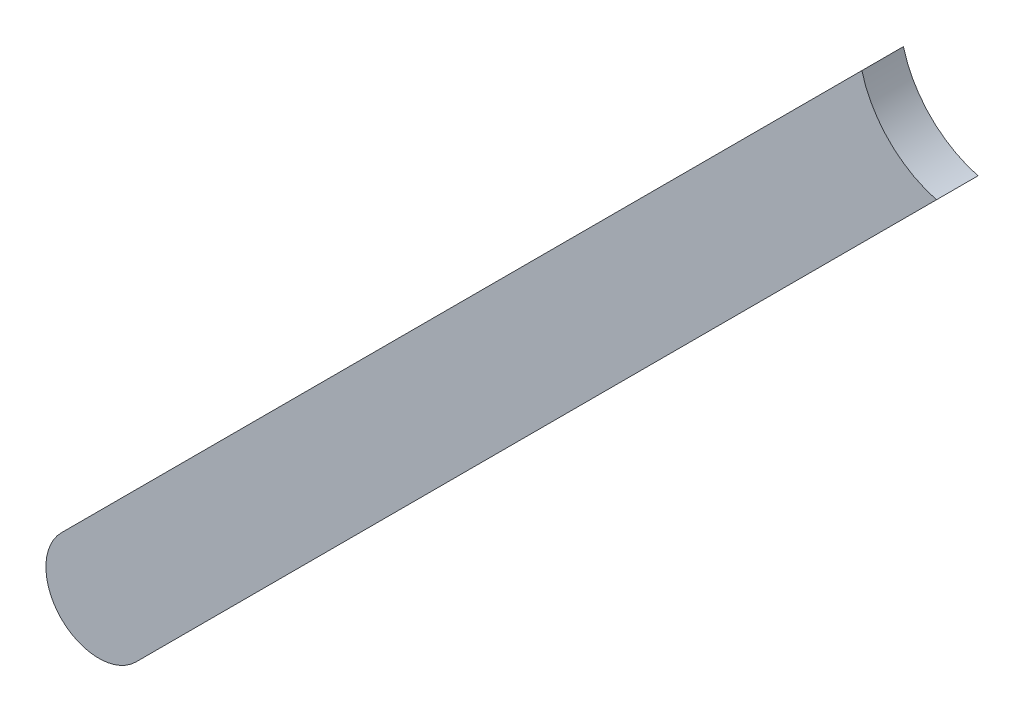
ISO-10303-21;
HEADER;
FILE_DESCRIPTION(('STEP AP214'),'2;1');
FILE_NAME('part.step','',(''),(''),'','','');
FILE_SCHEMA(('AUTOMOTIVE_DESIGN { 1 0 10303 214 1 1 1 1 }'));
ENDSEC;
DATA;
#1=APPLICATION_CONTEXT('core data for automotive mechanical design processes');
#2=APPLICATION_PROTOCOL_DEFINITION('international standard','automotive_design',2000,#1);
#3=PRODUCT_CONTEXT('',#1,'mechanical');
#4=PRODUCT('Part','Part','',(#3));
#5=PRODUCT_RELATED_PRODUCT_CATEGORY('part','',(#4));
#6=PRODUCT_DEFINITION_FORMATION('','',#4);
#7=PRODUCT_DEFINITION_CONTEXT('part definition',#1,'design');
#8=PRODUCT_DEFINITION('design','',#6,#7);
#9=PRODUCT_DEFINITION_SHAPE('','',#8);
#10=(LENGTH_UNIT() NAMED_UNIT(*) SI_UNIT(.MILLI.,.METRE.));
#11=(NAMED_UNIT(*) PLANE_ANGLE_UNIT() SI_UNIT($,.RADIAN.));
#12=(NAMED_UNIT(*) SI_UNIT($,.STERADIAN.) SOLID_ANGLE_UNIT());
#13=UNCERTAINTY_MEASURE_WITH_UNIT(LENGTH_MEASURE(1.E-05),#10,'distance_accuracy_value','');
#14=(GEOMETRIC_REPRESENTATION_CONTEXT(3) GLOBAL_UNCERTAINTY_ASSIGNED_CONTEXT((#13)) GLOBAL_UNIT_ASSIGNED_CONTEXT((#10,
#11,#12)) REPRESENTATION_CONTEXT('',''));
#15=CARTESIAN_POINT('',(0.,0.,0.));
#16=DIRECTION('',(0.,0.,1.));
#17=DIRECTION('',(1.,0.,0.));
#18=AXIS2_PLACEMENT_3D('',#15,#16,#17);
#19=CARTESIAN_POINT('',(142.57200594,113.63779406,0.));
#20=DIRECTION('',(-0.707106781186549,0.707106781186546,0.));
#21=DIRECTION('',(0.707106781186546,0.707106781186549,0.));
#22=AXIS2_PLACEMENT_3D('',#19,#20,#21);
#23=PLANE('',#22);
#24=DIRECTION('',(0.707106781186546,0.707106781186549,0.));
#25=VECTOR('',#24,1.);
#26=CARTESIAN_POINT('',(142.57200594,113.63779406,0.1999996));
#27=LINE('',#26,#25);
#28=CARTESIAN_POINT('',(142.57200594,113.63779406,0.1999996));
#29=VERTEX_POINT('',#28);
#30=CARTESIAN_POINT('',(146.426521214697,117.492309334697,0.1999996));
#31=VERTEX_POINT('',#30);
#32=EDGE_CURVE('E11',#29,#31,#27,.T.);
#33=ORIENTED_EDGE('',*,*,#32,.F.);
#34=DIRECTION('',(0.,0.,1.));
#35=VECTOR('',#34,1.);
#36=CARTESIAN_POINT('',(142.57200594,113.63779406,0.));
#37=LINE('',#36,#35);
#38=CARTESIAN_POINT('',(142.57200594,113.63779406,0.));
#39=VERTEX_POINT('',#38);
#40=EDGE_CURVE('E24',#39,#29,#37,.T.);
#41=ORIENTED_EDGE('',*,*,#40,.F.);
#42=DIRECTION('',(0.707106781186546,0.707106781186549,0.));
#43=VECTOR('',#42,1.);
#44=CARTESIAN_POINT('',(142.57200594,113.63779406,0.));
#45=LINE('',#44,#43);
#46=CARTESIAN_POINT('',(146.426521214697,117.492309334697,0.));
#47=VERTEX_POINT('',#46);
#48=EDGE_CURVE('E75',#39,#47,#45,.T.);
#49=ORIENTED_EDGE('',*,*,#48,.T.);
#50=DIRECTION('',(0.,0.,1.));
#51=VECTOR('',#50,1.);
#52=CARTESIAN_POINT('',(146.426521214697,117.492309334697,0.));
#53=LINE('',#52,#51);
#54=EDGE_CURVE('E37',#47,#31,#53,.T.);
#55=ORIENTED_EDGE('',*,*,#54,.T.);
#56=EDGE_LOOP('',(#33,#41,#49,#55));
#57=FACE_BOUND('',#56,.T.);
#58=ADVANCED_FACE('F17',(#57),#23,.F.);
#59=CARTESIAN_POINT('',(146.558,117.983,0.));
#60=DIRECTION('',(0.,0.,-1.));
#61=DIRECTION('',(1.,0.,0.));
#62=AXIS2_PLACEMENT_3D('',#59,#60,#61);
#63=CYLINDRICAL_SURFACE('',#62,0.508);
#64=DIRECTION('',(0.,0.,1.));
#65=VECTOR('',#64,1.);
#66=CARTESIAN_POINT('',(146.067309334697,117.851521214697,0.));
#67=LINE('',#66,#65);
#68=CARTESIAN_POINT('',(146.067309334697,117.851521214697,0.));
#69=VERTEX_POINT('',#68);
#70=CARTESIAN_POINT('',(146.067309334697,117.851521214697,0.1999996));
#71=VERTEX_POINT('',#70);
#72=EDGE_CURVE('E67',#69,#71,#67,.T.);
#73=ORIENTED_EDGE('',*,*,#72,.T.);
#74=CARTESIAN_POINT('',(146.558,117.983,0.1999996));
#75=DIRECTION('',(0.,0.,1.));
#76=DIRECTION('',(1.,0.,0.));
#77=AXIS2_PLACEMENT_3D('',#74,#75,#76);
#78=CIRCLE('',#77,0.508);
#79=EDGE_CURVE('E82',#71,#31,#78,.T.);
#80=ORIENTED_EDGE('',*,*,#79,.T.);
#81=ORIENTED_EDGE('',*,*,#54,.F.);
#82=CARTESIAN_POINT('',(146.558,117.983,0.));
#83=DIRECTION('',(0.,0.,1.));
#84=DIRECTION('',(1.,0.,0.));
#85=AXIS2_PLACEMENT_3D('',#82,#83,#84);
#86=CIRCLE('',#85,0.508);
#87=EDGE_CURVE('E80',#69,#47,#86,.T.);
#88=ORIENTED_EDGE('',*,*,#87,.F.);
#89=EDGE_LOOP('',(#73,#80,#81,#88));
#90=FACE_BOUND('',#89,.T.);
#91=ADVANCED_FACE('F88',(#90),#63,.F.);
#92=CARTESIAN_POINT('',(146.067309334697,117.851521214697,0.));
#93=DIRECTION('',(0.707106781186549,-0.707106781186546,0.));
#94=DIRECTION('',(-0.707106781186546,-0.707106781186549,0.));
#95=AXIS2_PLACEMENT_3D('',#92,#93,#94);
#96=PLANE('',#95);
#97=DIRECTION('',(-0.707106781186546,-0.707106781186549,0.));
#98=VECTOR('',#97,1.);
#99=CARTESIAN_POINT('',(146.37839406,118.16260594,0.1999996));
#100=LINE('',#99,#98);
#101=CARTESIAN_POINT('',(142.21279406,113.99700594,0.1999996));
#102=VERTEX_POINT('',#101);
#103=EDGE_CURVE('E71',#71,#102,#100,.T.);
#104=ORIENTED_EDGE('',*,*,#103,.F.);
#105=ORIENTED_EDGE('',*,*,#72,.F.);
#106=DIRECTION('',(-0.707106781186546,-0.707106781186549,0.));
#107=VECTOR('',#106,1.);
#108=CARTESIAN_POINT('',(146.37839406,118.16260594,0.));
#109=LINE('',#108,#107);
#110=CARTESIAN_POINT('',(142.21279406,113.99700594,0.));
#111=VERTEX_POINT('',#110);
#112=EDGE_CURVE('E63',#69,#111,#109,.T.);
#113=ORIENTED_EDGE('',*,*,#112,.T.);
#114=DIRECTION('',(0.,0.,1.));
#115=VECTOR('',#114,1.);
#116=CARTESIAN_POINT('',(142.21279406,113.99700594,0.));
#117=LINE('',#116,#115);
#118=EDGE_CURVE('E53',#111,#102,#117,.T.);
#119=ORIENTED_EDGE('',*,*,#118,.T.);
#120=EDGE_LOOP('',(#104,#105,#113,#119));
#121=FACE_BOUND('',#120,.T.);
#122=ADVANCED_FACE('F66',(#121),#96,.F.);
#123=CARTESIAN_POINT('',(142.3924,113.8174,0.));
#124=DIRECTION('',(0.,0.,-1.));
#125=DIRECTION('',(-0.707106781186576,0.70710678118652,0.));
#126=AXIS2_PLACEMENT_3D('',#123,#124,#125);
#127=CYLINDRICAL_SURFACE('',#126,0.254001156230774);
#128=CARTESIAN_POINT('',(142.3924,113.8174,0.1999996));
#129=DIRECTION('',(0.,0.,1.));
#130=DIRECTION('',(-0.707106781186576,0.70710678118652,0.));
#131=AXIS2_PLACEMENT_3D('',#128,#129,#130);
#132=CIRCLE('',#131,0.254001156230774);
#133=EDGE_CURVE('E59',#102,#29,#132,.T.);
#134=ORIENTED_EDGE('',*,*,#133,.F.);
#135=ORIENTED_EDGE('',*,*,#118,.F.);
#136=CARTESIAN_POINT('',(142.3924,113.8174,0.));
#137=DIRECTION('',(0.,0.,1.));
#138=DIRECTION('',(-0.707106781186576,0.70710678118652,0.));
#139=AXIS2_PLACEMENT_3D('',#136,#137,#138);
#140=CIRCLE('',#139,0.254001156230774);
#141=EDGE_CURVE('E57',#111,#39,#140,.T.);
#142=ORIENTED_EDGE('',*,*,#141,.T.);
#143=ORIENTED_EDGE('',*,*,#40,.T.);
#144=EDGE_LOOP('',(#134,#135,#142,#143));
#145=FACE_BOUND('',#144,.T.);
#146=ADVANCED_FACE('F55',(#145),#127,.T.);
#147=CARTESIAN_POINT('',(142.57200594,113.63779406,0.));
#148=DIRECTION('',(0.,0.,-1.));
#149=DIRECTION('',(-1.,0.,0.));
#150=AXIS2_PLACEMENT_3D('',#147,#148,#149);
#151=PLANE('',#150);
#152=ORIENTED_EDGE('',*,*,#48,.F.);
#153=ORIENTED_EDGE('',*,*,#141,.F.);
#154=ORIENTED_EDGE('',*,*,#112,.F.);
#155=ORIENTED_EDGE('',*,*,#87,.T.);
#156=EDGE_LOOP('',(#152,#153,#154,#155));
#157=FACE_BOUND('',#156,.T.);
#158=ADVANCED_FACE('F74',(#157),#151,.T.);
#159=CARTESIAN_POINT('',(142.57200594,113.63779406,0.1999996));
#160=DIRECTION('',(0.,0.,-1.));
#161=DIRECTION('',(-1.,0.,0.));
#162=AXIS2_PLACEMENT_3D('',#159,#160,#161);
#163=PLANE('',#162);
#164=ORIENTED_EDGE('',*,*,#133,.T.);
#165=ORIENTED_EDGE('',*,*,#32,.T.);
#166=ORIENTED_EDGE('',*,*,#79,.F.);
#167=ORIENTED_EDGE('',*,*,#103,.T.);
#168=EDGE_LOOP('',(#164,#165,#166,#167));
#169=FACE_BOUND('',#168,.T.);
#170=ADVANCED_FACE('F91',(#169),#163,.F.);
#171=CLOSED_SHELL('',(#58,#91,#122,#146,#158,#170));
#172=MANIFOLD_SOLID_BREP('B1',#171);
#173=ADVANCED_BREP_SHAPE_REPRESENTATION('',(#18,#172),#14);
#174=SHAPE_DEFINITION_REPRESENTATION(#9,#173);
ENDSEC;
END-ISO-10303-21;
